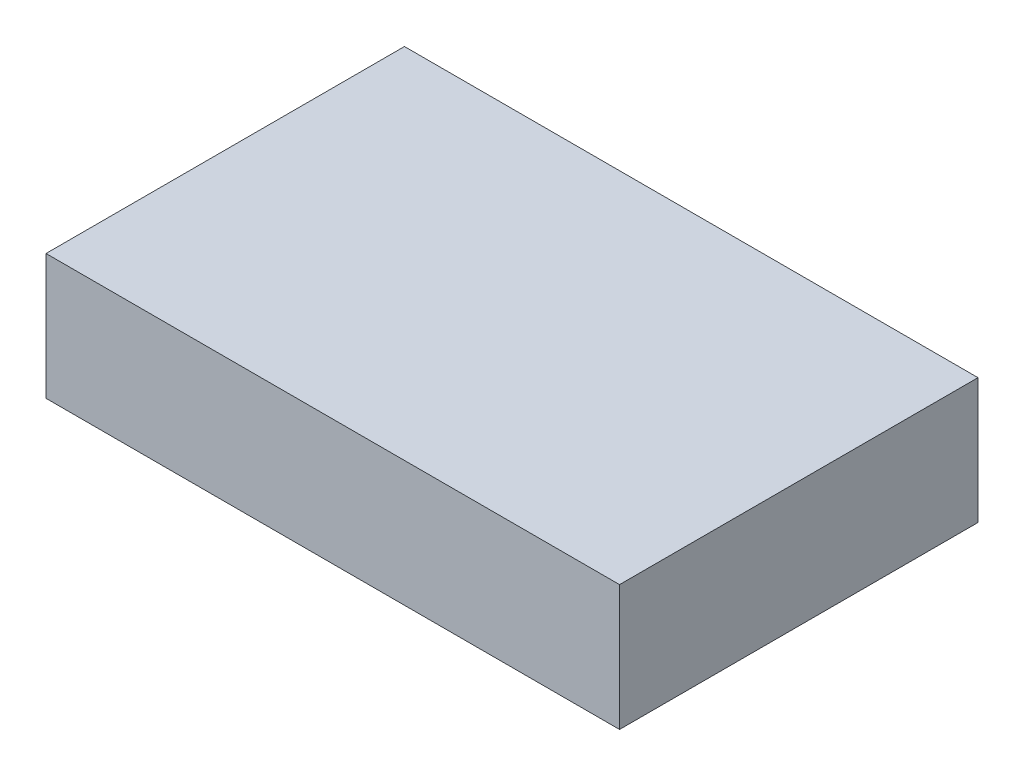
ISO-10303-21;
HEADER;
FILE_DESCRIPTION(('STEP AP214'),'2;1');
FILE_NAME('part.step','',(''),(''),'','','');
FILE_SCHEMA(('AUTOMOTIVE_DESIGN { 1 0 10303 214 1 1 1 1 }'));
ENDSEC;
DATA;
#1=APPLICATION_CONTEXT('core data for automotive mechanical design processes');
#2=APPLICATION_PROTOCOL_DEFINITION('international standard','automotive_design',2000,#1);
#3=PRODUCT_CONTEXT('',#1,'mechanical');
#4=PRODUCT('Part','Part','',(#3));
#5=PRODUCT_RELATED_PRODUCT_CATEGORY('part','',(#4));
#6=PRODUCT_DEFINITION_FORMATION('','',#4);
#7=PRODUCT_DEFINITION_CONTEXT('part definition',#1,'design');
#8=PRODUCT_DEFINITION('design','',#6,#7);
#9=PRODUCT_DEFINITION_SHAPE('','',#8);
#10=(LENGTH_UNIT() NAMED_UNIT(*) SI_UNIT(.MILLI.,.METRE.));
#11=(NAMED_UNIT(*) PLANE_ANGLE_UNIT() SI_UNIT($,.RADIAN.));
#12=(NAMED_UNIT(*) SI_UNIT($,.STERADIAN.) SOLID_ANGLE_UNIT());
#13=UNCERTAINTY_MEASURE_WITH_UNIT(LENGTH_MEASURE(1.E-05),#10,'distance_accuracy_value','');
#14=(GEOMETRIC_REPRESENTATION_CONTEXT(3) GLOBAL_UNCERTAINTY_ASSIGNED_CONTEXT((#13)) GLOBAL_UNIT_ASSIGNED_CONTEXT((#10,
#11,#12)) REPRESENTATION_CONTEXT('',''));
#15=CARTESIAN_POINT('',(0.,0.,0.));
#16=DIRECTION('',(0.,0.,1.));
#17=DIRECTION('',(1.,0.,0.));
#18=AXIS2_PLACEMENT_3D('',#15,#16,#17);
#19=CARTESIAN_POINT('',(203.2,88.9,-127.));
#20=DIRECTION('',(-1.,0.,0.));
#21=DIRECTION('',(0.,0.,1.));
#22=AXIS2_PLACEMENT_3D('',#19,#20,#21);
#23=PLANE('',#22);
#24=DIRECTION('',(0.,0.,-1.));
#25=VECTOR('',#24,1.);
#26=CARTESIAN_POINT('',(203.2,0.,-127.));
#27=LINE('',#26,#25);
#28=CARTESIAN_POINT('',(203.2,0.,127.));
#29=VERTEX_POINT('',#28);
#30=CARTESIAN_POINT('',(203.2,0.,-127.));
#31=VERTEX_POINT('',#30);
#32=EDGE_CURVE('E96',#29,#31,#27,.T.);
#33=ORIENTED_EDGE('',*,*,#32,.T.);
#34=DIRECTION('',(0.,-1.,0.));
#35=VECTOR('',#34,1.);
#36=CARTESIAN_POINT('',(203.2,88.9,-127.));
#37=LINE('',#36,#35);
#38=CARTESIAN_POINT('',(203.2,88.9,-127.));
#39=VERTEX_POINT('',#38);
#40=EDGE_CURVE('E11',#39,#31,#37,.T.);
#41=ORIENTED_EDGE('',*,*,#40,.F.);
#42=DIRECTION('',(0.,0.,-1.));
#43=VECTOR('',#42,1.);
#44=CARTESIAN_POINT('',(203.2,88.9,-127.));
#45=LINE('',#44,#43);
#46=CARTESIAN_POINT('',(203.2,88.9,127.));
#47=VERTEX_POINT('',#46);
#48=EDGE_CURVE('E84',#47,#39,#45,.T.);
#49=ORIENTED_EDGE('',*,*,#48,.F.);
#50=DIRECTION('',(0.,-1.,0.));
#51=VECTOR('',#50,1.);
#52=CARTESIAN_POINT('',(203.2,88.9,127.));
#53=LINE('',#52,#51);
#54=EDGE_CURVE('E92',#47,#29,#53,.T.);
#55=ORIENTED_EDGE('',*,*,#54,.T.);
#56=EDGE_LOOP('',(#33,#41,#49,#55));
#57=FACE_BOUND('',#56,.T.);
#58=ADVANCED_FACE('F33',(#57),#23,.F.);
#59=CARTESIAN_POINT('',(-203.2,88.9,-127.));
#60=DIRECTION('',(0.,0.,1.));
#61=DIRECTION('',(1.,0.,0.));
#62=AXIS2_PLACEMENT_3D('',#59,#60,#61);
#63=PLANE('',#62);
#64=DIRECTION('',(-1.,0.,0.));
#65=VECTOR('',#64,1.);
#66=CARTESIAN_POINT('',(-203.2,0.,-127.));
#67=LINE('',#66,#65);
#68=CARTESIAN_POINT('',(-203.2,0.,-127.));
#69=VERTEX_POINT('',#68);
#70=EDGE_CURVE('E88',#31,#69,#67,.T.);
#71=ORIENTED_EDGE('',*,*,#70,.T.);
#72=DIRECTION('',(0.,-1.,0.));
#73=VECTOR('',#72,1.);
#74=CARTESIAN_POINT('',(-203.2,88.9,-127.));
#75=LINE('',#74,#73);
#76=CARTESIAN_POINT('',(-203.2,88.9,-127.));
#77=VERTEX_POINT('',#76);
#78=EDGE_CURVE('E41',#77,#69,#75,.T.);
#79=ORIENTED_EDGE('',*,*,#78,.F.);
#80=DIRECTION('',(-1.,0.,0.));
#81=VECTOR('',#80,1.);
#82=CARTESIAN_POINT('',(-203.2,88.9,-127.));
#83=LINE('',#82,#81);
#84=EDGE_CURVE('E79',#39,#77,#83,.T.);
#85=ORIENTED_EDGE('',*,*,#84,.F.);
#86=ORIENTED_EDGE('',*,*,#40,.T.);
#87=EDGE_LOOP('',(#71,#79,#85,#86));
#88=FACE_BOUND('',#87,.T.);
#89=ADVANCED_FACE('F87',(#88),#63,.F.);
#90=CARTESIAN_POINT('',(-203.2,88.9,-127.));
#91=DIRECTION('',(1.,0.,0.));
#92=DIRECTION('',(0.,0.,-1.));
#93=AXIS2_PLACEMENT_3D('',#90,#91,#92);
#94=PLANE('',#93);
#95=DIRECTION('',(0.,0.,1.));
#96=VECTOR('',#95,1.);
#97=CARTESIAN_POINT('',(-203.2,0.,-127.));
#98=LINE('',#97,#96);
#99=CARTESIAN_POINT('',(-203.2,0.,127.));
#100=VERTEX_POINT('',#99);
#101=EDGE_CURVE('E66',#69,#100,#98,.T.);
#102=ORIENTED_EDGE('',*,*,#101,.T.);
#103=DIRECTION('',(0.,-1.,0.));
#104=VECTOR('',#103,1.);
#105=CARTESIAN_POINT('',(-203.2,88.9,127.));
#106=LINE('',#105,#104);
#107=CARTESIAN_POINT('',(-203.2,88.9,127.));
#108=VERTEX_POINT('',#107);
#109=EDGE_CURVE('E89',#108,#100,#106,.T.);
#110=ORIENTED_EDGE('',*,*,#109,.F.);
#111=DIRECTION('',(0.,0.,1.));
#112=VECTOR('',#111,1.);
#113=CARTESIAN_POINT('',(-203.2,88.9,-127.));
#114=LINE('',#113,#112);
#115=EDGE_CURVE('E82',#77,#108,#114,.T.);
#116=ORIENTED_EDGE('',*,*,#115,.F.);
#117=ORIENTED_EDGE('',*,*,#78,.T.);
#118=EDGE_LOOP('',(#102,#110,#116,#117));
#119=FACE_BOUND('',#118,.T.);
#120=ADVANCED_FACE('F90',(#119),#94,.F.);
#121=CARTESIAN_POINT('',(-203.2,88.9,127.));
#122=DIRECTION('',(0.,0.,-1.));
#123=DIRECTION('',(-1.,0.,0.));
#124=AXIS2_PLACEMENT_3D('',#121,#122,#123);
#125=PLANE('',#124);
#126=DIRECTION('',(1.,0.,0.));
#127=VECTOR('',#126,1.);
#128=CARTESIAN_POINT('',(-203.2,0.,127.));
#129=LINE('',#128,#127);
#130=EDGE_CURVE('E72',#100,#29,#129,.T.);
#131=ORIENTED_EDGE('',*,*,#130,.T.);
#132=ORIENTED_EDGE('',*,*,#54,.F.);
#133=DIRECTION('',(1.,0.,0.));
#134=VECTOR('',#133,1.);
#135=CARTESIAN_POINT('',(-203.2,88.9,127.));
#136=LINE('',#135,#134);
#137=EDGE_CURVE('E49',#108,#47,#136,.T.);
#138=ORIENTED_EDGE('',*,*,#137,.F.);
#139=ORIENTED_EDGE('',*,*,#109,.T.);
#140=EDGE_LOOP('',(#131,#132,#138,#139));
#141=FACE_BOUND('',#140,.T.);
#142=ADVANCED_FACE('F103',(#141),#125,.F.);
#143=CARTESIAN_POINT('',(0.,88.9,0.));
#144=DIRECTION('',(0.,1.,0.));
#145=DIRECTION('',(0.,0.,1.));
#146=AXIS2_PLACEMENT_3D('',#143,#144,#145);
#147=PLANE('',#146);
#148=ORIENTED_EDGE('',*,*,#48,.T.);
#149=ORIENTED_EDGE('',*,*,#84,.T.);
#150=ORIENTED_EDGE('',*,*,#115,.T.);
#151=ORIENTED_EDGE('',*,*,#137,.T.);
#152=EDGE_LOOP('',(#148,#149,#150,#151));
#153=FACE_BOUND('',#152,.T.);
#154=ADVANCED_FACE('F80',(#153),#147,.T.);
#155=CARTESIAN_POINT('',(0.,0.,0.));
#156=DIRECTION('',(0.,1.,0.));
#157=DIRECTION('',(0.,0.,1.));
#158=AXIS2_PLACEMENT_3D('',#155,#156,#157);
#159=PLANE('',#158);
#160=ORIENTED_EDGE('',*,*,#32,.F.);
#161=ORIENTED_EDGE('',*,*,#130,.F.);
#162=ORIENTED_EDGE('',*,*,#101,.F.);
#163=ORIENTED_EDGE('',*,*,#70,.F.);
#164=EDGE_LOOP('',(#160,#161,#162,#163));
#165=FACE_BOUND('',#164,.T.);
#166=ADVANCED_FACE('F106',(#165),#159,.F.);
#167=CLOSED_SHELL('',(#58,#89,#120,#142,#154,#166));
#168=MANIFOLD_SOLID_BREP('B2',#167);
#169=ADVANCED_BREP_SHAPE_REPRESENTATION('',(#18,#168),#14);
#170=SHAPE_DEFINITION_REPRESENTATION(#9,#169);
ENDSEC;
END-ISO-10303-21;
